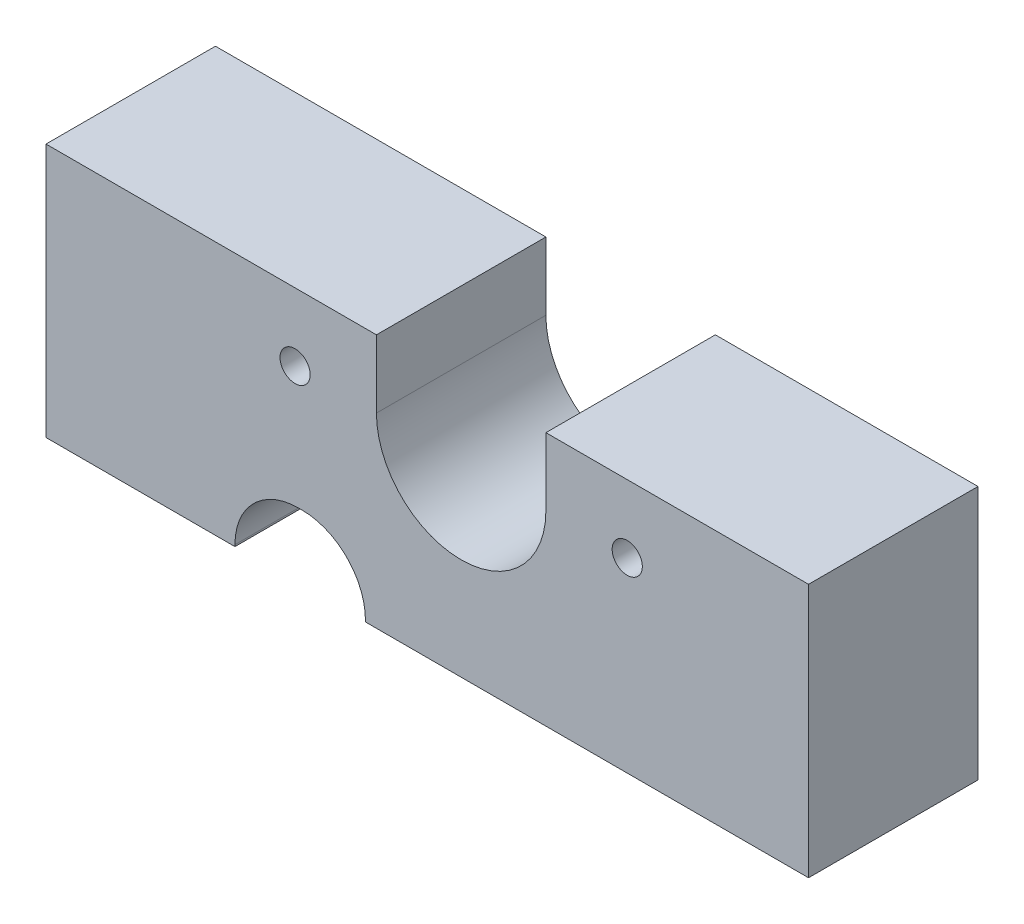
ISO-10303-21;
HEADER;
FILE_DESCRIPTION(('STEP AP214'),'2;1');
FILE_NAME('part.step','',(''),(''),'','','');
FILE_SCHEMA(('AUTOMOTIVE_DESIGN { 1 0 10303 214 1 1 1 1 }'));
ENDSEC;
DATA;
#1=APPLICATION_CONTEXT('core data for automotive mechanical design processes');
#2=APPLICATION_PROTOCOL_DEFINITION('international standard','automotive_design',2000,#1);
#3=PRODUCT_CONTEXT('',#1,'mechanical');
#4=PRODUCT('Part','Part','',(#3));
#5=PRODUCT_RELATED_PRODUCT_CATEGORY('part','',(#4));
#6=PRODUCT_DEFINITION_FORMATION('','',#4);
#7=PRODUCT_DEFINITION_CONTEXT('part definition',#1,'design');
#8=PRODUCT_DEFINITION('design','',#6,#7);
#9=PRODUCT_DEFINITION_SHAPE('','',#8);
#10=(LENGTH_UNIT() NAMED_UNIT(*) SI_UNIT(.MILLI.,.METRE.));
#11=(NAMED_UNIT(*) PLANE_ANGLE_UNIT() SI_UNIT($,.RADIAN.));
#12=(NAMED_UNIT(*) SI_UNIT($,.STERADIAN.) SOLID_ANGLE_UNIT());
#13=UNCERTAINTY_MEASURE_WITH_UNIT(LENGTH_MEASURE(1.E-05),#10,'distance_accuracy_value','');
#14=(GEOMETRIC_REPRESENTATION_CONTEXT(3) GLOBAL_UNCERTAINTY_ASSIGNED_CONTEXT((#13)) GLOBAL_UNIT_ASSIGNED_CONTEXT((#10,
#11,#12)) REPRESENTATION_CONTEXT('',''));
#15=CARTESIAN_POINT('',(0.,0.,0.));
#16=DIRECTION('',(0.,0.,1.));
#17=DIRECTION('',(1.,0.,0.));
#18=AXIS2_PLACEMENT_3D('',#15,#16,#17);
#19=CARTESIAN_POINT('',(-57.15,0.,0.));
#20=DIRECTION('',(0.,-1.,0.));
#21=DIRECTION('',(0.,0.,-1.));
#22=AXIS2_PLACEMENT_3D('',#19,#20,#21);
#23=PLANE('',#22);
#24=DIRECTION('',(0.,0.,-1.));
#25=VECTOR('',#24,1.);
#26=CARTESIAN_POINT('',(-42.9895,0.,0.));
#27=LINE('',#26,#25);
#28=CARTESIAN_POINT('',(-42.9895,0.,0.));
#29=VERTEX_POINT('',#28);
#30=CARTESIAN_POINT('',(-42.9895,0.,-12.7));
#31=VERTEX_POINT('',#30);
#32=EDGE_CURVE('E191',#29,#31,#27,.T.);
#33=ORIENTED_EDGE('',*,*,#32,.F.);
#34=DIRECTION('',(1.,0.,0.));
#35=VECTOR('',#34,1.);
#36=CARTESIAN_POINT('',(-57.15,0.,0.));
#37=LINE('',#36,#35);
#38=CARTESIAN_POINT('',(-57.15,0.,0.));
#39=VERTEX_POINT('',#38);
#40=EDGE_CURVE('E41',#39,#29,#37,.T.);
#41=ORIENTED_EDGE('',*,*,#40,.F.);
#42=DIRECTION('',(0.,0.,-1.));
#43=VECTOR('',#42,1.);
#44=CARTESIAN_POINT('',(-57.15,0.,0.));
#45=LINE('',#44,#43);
#46=CARTESIAN_POINT('',(-57.15,0.,-12.7));
#47=VERTEX_POINT('',#46);
#48=EDGE_CURVE('E261',#39,#47,#45,.T.);
#49=ORIENTED_EDGE('',*,*,#48,.T.);
#50=DIRECTION('',(1.,0.,0.));
#51=VECTOR('',#50,1.);
#52=CARTESIAN_POINT('',(-57.15,0.,-12.7));
#53=LINE('',#52,#51);
#54=EDGE_CURVE('E285',#47,#31,#53,.T.);
#55=ORIENTED_EDGE('',*,*,#54,.T.);
#56=EDGE_LOOP('',(#33,#41,#49,#55));
#57=FACE_BOUND('',#56,.T.);
#58=CARTESIAN_POINT('',(-50.8,0.,-6.35));
#59=DIRECTION('',(0.,-1.,0.));
#60=DIRECTION('',(0.,0.,-1.));
#61=AXIS2_PLACEMENT_3D('',#58,#59,#60);
#62=CIRCLE('',#61,1.7526);
#63=CARTESIAN_POINT('',(-50.8,0.,-8.1026));
#64=VERTEX_POINT('',#63);
#65=EDGE_CURVE('E245',#64,#64,#62,.T.);
#66=ORIENTED_EDGE('',*,*,#65,.F.);
#67=EDGE_LOOP('',(#66));
#68=FACE_BOUND('',#67,.T.);
#69=ADVANCED_FACE('F37',(#57,#68),#23,.T.);
#70=CARTESIAN_POINT('',(-57.15,19.05,0.));
#71=DIRECTION('',(0.,1.,0.));
#72=DIRECTION('',(0.,0.,1.));
#73=AXIS2_PLACEMENT_3D('',#70,#71,#72);
#74=PLANE('',#73);
#75=DIRECTION('',(0.,0.,-1.));
#76=VECTOR('',#75,1.);
#77=CARTESIAN_POINT('',(-32.385,19.05,0.));
#78=LINE('',#77,#76);
#79=CARTESIAN_POINT('',(-32.385,19.05,0.));
#80=VERTEX_POINT('',#79);
#81=CARTESIAN_POINT('',(-32.385,19.05,-12.7));
#82=VERTEX_POINT('',#81);
#83=EDGE_CURVE('E225',#80,#82,#78,.T.);
#84=ORIENTED_EDGE('',*,*,#83,.T.);
#85=DIRECTION('',(1.,0.,0.));
#86=VECTOR('',#85,1.);
#87=CARTESIAN_POINT('',(-57.15,19.05,-12.7));
#88=LINE('',#87,#86);
#89=CARTESIAN_POINT('',(-57.15,19.05,-12.7));
#90=VERTEX_POINT('',#89);
#91=EDGE_CURVE('E282',#90,#82,#88,.T.);
#92=ORIENTED_EDGE('',*,*,#91,.F.);
#93=DIRECTION('',(0.,0.,1.));
#94=VECTOR('',#93,1.);
#95=CARTESIAN_POINT('',(-57.15,19.05,0.));
#96=LINE('',#95,#94);
#97=CARTESIAN_POINT('',(-57.15,19.05,0.));
#98=VERTEX_POINT('',#97);
#99=EDGE_CURVE('E268',#90,#98,#96,.T.);
#100=ORIENTED_EDGE('',*,*,#99,.T.);
#101=DIRECTION('',(1.,0.,0.));
#102=VECTOR('',#101,1.);
#103=CARTESIAN_POINT('',(-57.15,19.05,0.));
#104=LINE('',#103,#102);
#105=EDGE_CURVE('E11',#98,#80,#104,.T.);
#106=ORIENTED_EDGE('',*,*,#105,.T.);
#107=EDGE_LOOP('',(#84,#92,#100,#106));
#108=FACE_BOUND('',#107,.T.);
#109=ADVANCED_FACE('F317',(#108),#74,.T.);
#110=CARTESIAN_POINT('',(-57.15,0.,0.));
#111=DIRECTION('',(0.,0.,1.));
#112=DIRECTION('',(1.,0.,0.));
#113=AXIS2_PLACEMENT_3D('',#110,#111,#112);
#114=PLANE('',#113);
#115=DIRECTION('',(0.,1.,0.));
#116=VECTOR('',#115,1.);
#117=CARTESIAN_POINT('',(-42.9895,0.,0.));
#118=LINE('',#117,#116);
#119=CARTESIAN_POINT('',(-42.9895,0.126999999999999,0.));
#120=VERTEX_POINT('',#119);
#121=EDGE_CURVE('E159',#29,#120,#118,.T.);
#122=ORIENTED_EDGE('',*,*,#121,.T.);
#123=CARTESIAN_POINT('',(-38.227,0.126999999999999,0.));
#124=DIRECTION('',(0.,0.,-1.));
#125=DIRECTION('',(1.,0.,0.));
#126=AXIS2_PLACEMENT_3D('',#123,#124,#125);
#127=CIRCLE('',#126,4.7625);
#128=CARTESIAN_POINT('',(-38.227,4.8895,0.));
#129=VERTEX_POINT('',#128);
#130=EDGE_CURVE('E151',#120,#129,#127,.T.);
#131=ORIENTED_EDGE('',*,*,#130,.T.);
#132=DIRECTION('',(1.,0.,0.));
#133=VECTOR('',#132,1.);
#134=CARTESIAN_POINT('',(-37.973,4.8895,0.));
#135=LINE('',#134,#133);
#136=CARTESIAN_POINT('',(-37.973,4.8895,0.));
#137=VERTEX_POINT('',#136);
#138=EDGE_CURVE('E162',#129,#137,#135,.T.);
#139=ORIENTED_EDGE('',*,*,#138,.T.);
#140=CARTESIAN_POINT('',(-37.973,0.126999999999999,0.));
#141=DIRECTION('',(0.,0.,-1.));
#142=DIRECTION('',(-1.,0.,0.));
#143=AXIS2_PLACEMENT_3D('',#140,#141,#142);
#144=CIRCLE('',#143,4.7625);
#145=CARTESIAN_POINT('',(-33.2105,0.126999999999999,0.));
#146=VERTEX_POINT('',#145);
#147=EDGE_CURVE('E167',#137,#146,#144,.T.);
#148=ORIENTED_EDGE('',*,*,#147,.T.);
#149=DIRECTION('',(0.,-1.,0.));
#150=VECTOR('',#149,1.);
#151=CARTESIAN_POINT('',(-33.2105,0.,0.));
#152=LINE('',#151,#150);
#153=CARTESIAN_POINT('',(-33.2105,0.,0.));
#154=VERTEX_POINT('',#153);
#155=EDGE_CURVE('E177',#146,#154,#152,.T.);
#156=ORIENTED_EDGE('',*,*,#155,.T.);
#157=CARTESIAN_POINT('',(0.,0.,0.));
#158=VERTEX_POINT('',#157);
#159=EDGE_CURVE('E271',#154,#158,#37,.T.);
#160=ORIENTED_EDGE('',*,*,#159,.T.);
#161=DIRECTION('',(0.,-1.,0.));
#162=VECTOR('',#161,1.);
#163=CARTESIAN_POINT('',(0.,0.,0.));
#164=LINE('',#163,#162);
#165=CARTESIAN_POINT('',(0.,19.05,0.));
#166=VERTEX_POINT('',#165);
#167=EDGE_CURVE('E257',#166,#158,#164,.T.);
#168=ORIENTED_EDGE('',*,*,#167,.F.);
#169=CARTESIAN_POINT('',(-19.685,19.05,0.));
#170=VERTEX_POINT('',#169);
#171=EDGE_CURVE('E46',#170,#166,#104,.T.);
#172=ORIENTED_EDGE('',*,*,#171,.F.);
#173=DIRECTION('',(0.,-1.,0.));
#174=VECTOR('',#173,1.);
#175=CARTESIAN_POINT('',(-19.685,19.05,0.));
#176=LINE('',#175,#174);
#177=CARTESIAN_POINT('',(-19.685,13.97,0.));
#178=VERTEX_POINT('',#177);
#179=EDGE_CURVE('E210',#170,#178,#176,.T.);
#180=ORIENTED_EDGE('',*,*,#179,.T.);
#181=CARTESIAN_POINT('',(-26.035,13.97,0.));
#182=DIRECTION('',(0.,0.,-1.));
#183=DIRECTION('',(-1.,0.,0.));
#184=AXIS2_PLACEMENT_3D('',#181,#182,#183);
#185=CIRCLE('',#184,6.34999999999999);
#186=CARTESIAN_POINT('',(-32.385,13.97,0.));
#187=VERTEX_POINT('',#186);
#188=EDGE_CURVE('E213',#178,#187,#185,.T.);
#189=ORIENTED_EDGE('',*,*,#188,.T.);
#190=DIRECTION('',(0.,1.,0.));
#191=VECTOR('',#190,1.);
#192=CARTESIAN_POINT('',(-32.385,19.05,0.));
#193=LINE('',#192,#191);
#194=EDGE_CURVE('E217',#187,#80,#193,.T.);
#195=ORIENTED_EDGE('',*,*,#194,.T.);
#196=ORIENTED_EDGE('',*,*,#105,.F.);
#197=DIRECTION('',(0.,-1.,0.));
#198=VECTOR('',#197,1.);
#199=CARTESIAN_POINT('',(-57.15,0.,0.));
#200=LINE('',#199,#198);
#201=EDGE_CURVE('E258',#98,#39,#200,.T.);
#202=ORIENTED_EDGE('',*,*,#201,.T.);
#203=ORIENTED_EDGE('',*,*,#40,.T.);
#204=EDGE_LOOP('',(#122,#131,#139,#148,#156,#160,#168,#172,#180,#189,#195,#196,#202,#203));
#205=FACE_BOUND('',#204,.T.);
#206=CARTESIAN_POINT('',(-13.589,13.97,0.));
#207=DIRECTION('',(0.,0.,-1.));
#208=DIRECTION('',(-1.,0.,0.));
#209=AXIS2_PLACEMENT_3D('',#206,#207,#208);
#210=CIRCLE('',#209,1.1303);
#211=CARTESIAN_POINT('',(-14.7193,13.97,0.));
#212=VERTEX_POINT('',#211);
#213=EDGE_CURVE('E200',#212,#212,#210,.T.);
#214=ORIENTED_EDGE('',*,*,#213,.T.);
#215=EDGE_LOOP('',(#214));
#216=FACE_BOUND('',#215,.T.);
#217=CARTESIAN_POINT('',(-38.481,13.97,0.));
#218=DIRECTION('',(0.,0.,-1.));
#219=DIRECTION('',(-1.,0.,0.));
#220=AXIS2_PLACEMENT_3D('',#217,#218,#219);
#221=CIRCLE('',#220,1.13029999999999);
#222=CARTESIAN_POINT('',(-39.6113,13.97,0.));
#223=VERTEX_POINT('',#222);
#224=EDGE_CURVE('E206',#223,#223,#221,.T.);
#225=ORIENTED_EDGE('',*,*,#224,.T.);
#226=EDGE_LOOP('',(#225));
#227=FACE_BOUND('',#226,.T.);
#228=ADVANCED_FACE('F39',(#205,#216,#227),#114,.T.);
#229=DIRECTION('',(0.,0.,-1.));
#230=VECTOR('',#229,1.);
#231=CARTESIAN_POINT('',(-19.685,19.05,0.));
#232=LINE('',#231,#230);
#233=CARTESIAN_POINT('',(-19.685,19.05,-12.7));
#234=VERTEX_POINT('',#233);
#235=EDGE_CURVE('E62',#170,#234,#232,.T.);
#236=ORIENTED_EDGE('',*,*,#235,.F.);
#237=ORIENTED_EDGE('',*,*,#171,.T.);
#238=DIRECTION('',(0.,0.,1.));
#239=VECTOR('',#238,1.);
#240=CARTESIAN_POINT('',(0.,19.05,0.));
#241=LINE('',#240,#239);
#242=CARTESIAN_POINT('',(0.,19.05,-12.7));
#243=VERTEX_POINT('',#242);
#244=EDGE_CURVE('E262',#243,#166,#241,.T.);
#245=ORIENTED_EDGE('',*,*,#244,.F.);
#246=EDGE_CURVE('E284',#234,#243,#88,.T.);
#247=ORIENTED_EDGE('',*,*,#246,.F.);
#248=EDGE_LOOP('',(#236,#237,#245,#247));
#249=FACE_BOUND('',#248,.T.);
#250=ADVANCED_FACE('F305',(#249),#74,.T.);
#251=CARTESIAN_POINT('',(-57.15,0.,-12.7));
#252=DIRECTION('',(0.,0.,-1.));
#253=DIRECTION('',(-1.,0.,0.));
#254=AXIS2_PLACEMENT_3D('',#251,#252,#253);
#255=PLANE('',#254);
#256=DIRECTION('',(0.,1.,0.));
#257=VECTOR('',#256,1.);
#258=CARTESIAN_POINT('',(-42.9895,0.,-12.7));
#259=LINE('',#258,#257);
#260=CARTESIAN_POINT('',(-42.9895,0.126999999999999,-12.7));
#261=VERTEX_POINT('',#260);
#262=EDGE_CURVE('E171',#31,#261,#259,.T.);
#263=ORIENTED_EDGE('',*,*,#262,.F.);
#264=ORIENTED_EDGE('',*,*,#54,.F.);
#265=DIRECTION('',(0.,1.,0.));
#266=VECTOR('',#265,1.);
#267=CARTESIAN_POINT('',(-57.15,0.,-12.7));
#268=LINE('',#267,#266);
#269=EDGE_CURVE('E265',#47,#90,#268,.T.);
#270=ORIENTED_EDGE('',*,*,#269,.T.);
#271=ORIENTED_EDGE('',*,*,#91,.T.);
#272=DIRECTION('',(0.,1.,0.));
#273=VECTOR('',#272,1.);
#274=CARTESIAN_POINT('',(-32.385,19.05,-12.7));
#275=LINE('',#274,#273);
#276=CARTESIAN_POINT('',(-32.385,13.97,-12.7));
#277=VERTEX_POINT('',#276);
#278=EDGE_CURVE('E214',#277,#82,#275,.T.);
#279=ORIENTED_EDGE('',*,*,#278,.F.);
#280=CARTESIAN_POINT('',(-26.035,13.97,-12.7));
#281=DIRECTION('',(0.,0.,-1.));
#282=DIRECTION('',(-1.,0.,0.));
#283=AXIS2_PLACEMENT_3D('',#280,#281,#282);
#284=CIRCLE('',#283,6.34999999999999);
#285=CARTESIAN_POINT('',(-19.685,13.97,-12.7));
#286=VERTEX_POINT('',#285);
#287=EDGE_CURVE('E221',#286,#277,#284,.T.);
#288=ORIENTED_EDGE('',*,*,#287,.F.);
#289=DIRECTION('',(0.,-1.,0.));
#290=VECTOR('',#289,1.);
#291=CARTESIAN_POINT('',(-19.685,19.05,-12.7));
#292=LINE('',#291,#290);
#293=EDGE_CURVE('E209',#234,#286,#292,.T.);
#294=ORIENTED_EDGE('',*,*,#293,.F.);
#295=ORIENTED_EDGE('',*,*,#246,.T.);
#296=DIRECTION('',(0.,1.,0.));
#297=VECTOR('',#296,1.);
#298=CARTESIAN_POINT('',(0.,0.,-12.7));
#299=LINE('',#298,#297);
#300=CARTESIAN_POINT('',(0.,0.,-12.7));
#301=VERTEX_POINT('',#300);
#302=EDGE_CURVE('E277',#301,#243,#299,.T.);
#303=ORIENTED_EDGE('',*,*,#302,.F.);
#304=CARTESIAN_POINT('',(-33.2105,0.,-12.7));
#305=VERTEX_POINT('',#304);
#306=EDGE_CURVE('E287',#305,#301,#53,.T.);
#307=ORIENTED_EDGE('',*,*,#306,.F.);
#308=DIRECTION('',(0.,-1.,0.));
#309=VECTOR('',#308,1.);
#310=CARTESIAN_POINT('',(-33.2105,0.,-12.7));
#311=LINE('',#310,#309);
#312=CARTESIAN_POINT('',(-33.2105,0.126999999999999,-12.7));
#313=VERTEX_POINT('',#312);
#314=EDGE_CURVE('E54',#313,#305,#311,.T.);
#315=ORIENTED_EDGE('',*,*,#314,.F.);
#316=CARTESIAN_POINT('',(-37.973,0.126999999999999,-12.7));
#317=DIRECTION('',(0.,0.,-1.));
#318=DIRECTION('',(-1.,0.,0.));
#319=AXIS2_PLACEMENT_3D('',#316,#317,#318);
#320=CIRCLE('',#319,4.7625);
#321=CARTESIAN_POINT('',(-37.973,4.8895,-12.7));
#322=VERTEX_POINT('',#321);
#323=EDGE_CURVE('E184',#322,#313,#320,.T.);
#324=ORIENTED_EDGE('',*,*,#323,.F.);
#325=DIRECTION('',(1.,0.,0.));
#326=VECTOR('',#325,1.);
#327=CARTESIAN_POINT('',(-37.973,4.8895,-12.7));
#328=LINE('',#327,#326);
#329=CARTESIAN_POINT('',(-38.227,4.8895,-12.7));
#330=VERTEX_POINT('',#329);
#331=EDGE_CURVE('E182',#330,#322,#328,.T.);
#332=ORIENTED_EDGE('',*,*,#331,.F.);
#333=CARTESIAN_POINT('',(-38.227,0.126999999999999,-12.7));
#334=DIRECTION('',(0.,0.,-1.));
#335=DIRECTION('',(1.,0.,0.));
#336=AXIS2_PLACEMENT_3D('',#333,#334,#335);
#337=CIRCLE('',#336,4.7625);
#338=EDGE_CURVE('E154',#261,#330,#337,.T.);
#339=ORIENTED_EDGE('',*,*,#338,.F.);
#340=EDGE_LOOP('',(#263,#264,#270,#271,#279,#288,#294,#295,#303,#307,#315,#324,#332,#339));
#341=FACE_BOUND('',#340,.T.);
#342=CARTESIAN_POINT('',(-13.589,13.97,-12.7));
#343=DIRECTION('',(0.,0.,-1.));
#344=DIRECTION('',(-1.,0.,0.));
#345=AXIS2_PLACEMENT_3D('',#342,#343,#344);
#346=CIRCLE('',#345,1.1303);
#347=CARTESIAN_POINT('',(-14.7193,13.97,-12.7));
#348=VERTEX_POINT('',#347);
#349=EDGE_CURVE('E190',#348,#348,#346,.T.);
#350=ORIENTED_EDGE('',*,*,#349,.F.);
#351=EDGE_LOOP('',(#350));
#352=FACE_BOUND('',#351,.T.);
#353=CARTESIAN_POINT('',(-38.481,13.97,-12.7));
#354=DIRECTION('',(0.,0.,-1.));
#355=DIRECTION('',(-1.,0.,0.));
#356=AXIS2_PLACEMENT_3D('',#353,#354,#355);
#357=CIRCLE('',#356,1.1303);
#358=CARTESIAN_POINT('',(-39.6113,13.97,-12.7));
#359=VERTEX_POINT('',#358);
#360=EDGE_CURVE('E203',#359,#359,#357,.T.);
#361=ORIENTED_EDGE('',*,*,#360,.F.);
#362=EDGE_LOOP('',(#361));
#363=FACE_BOUND('',#362,.T.);
#364=ADVANCED_FACE('F328',(#341,#352,#363),#255,.T.);
#365=DIRECTION('',(0.,0.,-1.));
#366=VECTOR('',#365,1.);
#367=CARTESIAN_POINT('',(-33.2105,0.,0.));
#368=LINE('',#367,#366);
#369=EDGE_CURVE('E193',#154,#305,#368,.T.);
#370=ORIENTED_EDGE('',*,*,#369,.T.);
#371=ORIENTED_EDGE('',*,*,#306,.T.);
#372=DIRECTION('',(0.,0.,-1.));
#373=VECTOR('',#372,1.);
#374=CARTESIAN_POINT('',(0.,0.,0.));
#375=LINE('',#374,#373);
#376=EDGE_CURVE('E274',#158,#301,#375,.T.);
#377=ORIENTED_EDGE('',*,*,#376,.F.);
#378=ORIENTED_EDGE('',*,*,#159,.F.);
#379=EDGE_LOOP('',(#370,#371,#377,#378));
#380=FACE_BOUND('',#379,.T.);
#381=CARTESIAN_POINT('',(-6.35,0.,-6.35000000000001));
#382=DIRECTION('',(0.,-1.,0.));
#383=DIRECTION('',(0.,0.,-1.));
#384=AXIS2_PLACEMENT_3D('',#381,#382,#383);
#385=CIRCLE('',#384,1.7526);
#386=CARTESIAN_POINT('',(-6.35,0.,-8.10260000000001));
#387=VERTEX_POINT('',#386);
#388=EDGE_CURVE('E228',#387,#387,#385,.T.);
#389=ORIENTED_EDGE('',*,*,#388,.F.);
#390=EDGE_LOOP('',(#389));
#391=FACE_BOUND('',#390,.T.);
#392=ADVANCED_FACE('F298',(#380,#391),#23,.T.);
#393=CARTESIAN_POINT('',(-57.15,0.,0.));
#394=DIRECTION('',(-1.,0.,0.));
#395=DIRECTION('',(0.,0.,1.));
#396=AXIS2_PLACEMENT_3D('',#393,#394,#395);
#397=PLANE('',#396);
#398=ORIENTED_EDGE('',*,*,#201,.F.);
#399=ORIENTED_EDGE('',*,*,#99,.F.);
#400=ORIENTED_EDGE('',*,*,#269,.F.);
#401=ORIENTED_EDGE('',*,*,#48,.F.);
#402=EDGE_LOOP('',(#398,#399,#400,#401));
#403=FACE_BOUND('',#402,.T.);
#404=ADVANCED_FACE('F321',(#403),#397,.T.);
#405=CARTESIAN_POINT('',(0.,0.,0.));
#406=DIRECTION('',(-1.,0.,0.));
#407=DIRECTION('',(0.,0.,1.));
#408=AXIS2_PLACEMENT_3D('',#405,#406,#407);
#409=PLANE('',#408);
#410=ORIENTED_EDGE('',*,*,#167,.T.);
#411=ORIENTED_EDGE('',*,*,#376,.T.);
#412=ORIENTED_EDGE('',*,*,#302,.T.);
#413=ORIENTED_EDGE('',*,*,#244,.T.);
#414=EDGE_LOOP('',(#410,#411,#412,#413));
#415=FACE_BOUND('',#414,.T.);
#416=ADVANCED_FACE('F301',(#415),#409,.F.);
#417=CARTESIAN_POINT('',(-50.8,12.7,-6.35));
#418=DIRECTION('',(0.,-1.,0.));
#419=DIRECTION('',(0.,0.,-1.));
#420=AXIS2_PLACEMENT_3D('',#417,#418,#419);
#421=CONICAL_SURFACE('',#420,1.35254999999999,1.02974425867665);
#422=CARTESIAN_POINT('',(-50.8,13.5126940302657,-6.35));
#423=VERTEX_POINT('',#422);
#424=VERTEX_LOOP('',#423);
#425=FACE_BOUND('',#424,.T.);
#426=CARTESIAN_POINT('',(-50.8,12.7,-6.35));
#427=DIRECTION('',(0.,-1.,0.));
#428=DIRECTION('',(0.,0.,-1.));
#429=AXIS2_PLACEMENT_3D('',#426,#427,#428);
#430=CIRCLE('',#429,1.35254999999999);
#431=CARTESIAN_POINT('',(-50.8,12.7,-7.70255));
#432=VERTEX_POINT('',#431);
#433=EDGE_CURVE('E254',#432,#432,#430,.T.);
#434=ORIENTED_EDGE('',*,*,#433,.T.);
#435=EDGE_LOOP('',(#434));
#436=FACE_BOUND('',#435,.T.);
#437=ADVANCED_FACE('F359',(#425,#436),#421,.F.);
#438=CARTESIAN_POINT('',(-50.8,0.,-6.35));
#439=DIRECTION('',(0.,-1.,0.));
#440=DIRECTION('',(0.,0.,-1.));
#441=AXIS2_PLACEMENT_3D('',#438,#439,#440);
#442=CYLINDRICAL_SURFACE('',#441,1.35254999999999);
#443=ORIENTED_EDGE('',*,*,#433,.F.);
#444=EDGE_LOOP('',(#443));
#445=FACE_BOUND('',#444,.T.);
#446=CARTESIAN_POINT('',(-50.8,10.795,-6.35));
#447=DIRECTION('',(0.,-1.,0.));
#448=DIRECTION('',(0.,0.,-1.));
#449=AXIS2_PLACEMENT_3D('',#446,#447,#448);
#450=CIRCLE('',#449,1.35254999999999);
#451=CARTESIAN_POINT('',(-50.8,10.795,-7.70255));
#452=VERTEX_POINT('',#451);
#453=EDGE_CURVE('E251',#452,#452,#450,.T.);
#454=ORIENTED_EDGE('',*,*,#453,.T.);
#455=EDGE_LOOP('',(#454));
#456=FACE_BOUND('',#455,.T.);
#457=ADVANCED_FACE('F363',(#445,#456),#442,.F.);
#458=CARTESIAN_POINT('',(-49.44745,10.795,-6.35));
#459=DIRECTION('',(0.,1.,0.));
#460=DIRECTION('',(0.,0.,1.));
#461=AXIS2_PLACEMENT_3D('',#458,#459,#460);
#462=PLANE('',#461);
#463=ORIENTED_EDGE('',*,*,#453,.F.);
#464=EDGE_LOOP('',(#463));
#465=FACE_BOUND('',#464,.T.);
#466=CARTESIAN_POINT('',(-50.8,10.795,-6.35));
#467=DIRECTION('',(0.,-1.,0.));
#468=DIRECTION('',(0.,0.,-1.));
#469=AXIS2_PLACEMENT_3D('',#466,#467,#468);
#470=CIRCLE('',#469,1.7526);
#471=CARTESIAN_POINT('',(-50.8,10.795,-8.1026));
#472=VERTEX_POINT('',#471);
#473=EDGE_CURVE('E248',#472,#472,#470,.T.);
#474=ORIENTED_EDGE('',*,*,#473,.T.);
#475=EDGE_LOOP('',(#474));
#476=FACE_BOUND('',#475,.T.);
#477=ADVANCED_FACE('F367',(#465,#476),#462,.F.);
#478=CARTESIAN_POINT('',(-50.8,0.,-6.35));
#479=DIRECTION('',(0.,-1.,0.));
#480=DIRECTION('',(0.,0.,-1.));
#481=AXIS2_PLACEMENT_3D('',#478,#479,#480);
#482=CYLINDRICAL_SURFACE('',#481,1.7526);
#483=ORIENTED_EDGE('',*,*,#473,.F.);
#484=EDGE_LOOP('',(#483));
#485=FACE_BOUND('',#484,.T.);
#486=ORIENTED_EDGE('',*,*,#65,.T.);
#487=EDGE_LOOP('',(#486));
#488=FACE_BOUND('',#487,.T.);
#489=ADVANCED_FACE('F371',(#485,#488),#482,.F.);
#490=CARTESIAN_POINT('',(-6.35,12.7,-6.35000000000001));
#491=DIRECTION('',(0.,-1.,0.));
#492=DIRECTION('',(0.,0.,-1.));
#493=AXIS2_PLACEMENT_3D('',#490,#491,#492);
#494=CONICAL_SURFACE('',#493,1.35255,1.02974425867665);
#495=CARTESIAN_POINT('',(-6.35,13.5126940302657,-6.35000000000001));
#496=VERTEX_POINT('',#495);
#497=VERTEX_LOOP('',#496);
#498=FACE_BOUND('',#497,.T.);
#499=CARTESIAN_POINT('',(-6.35,12.7,-6.35000000000001));
#500=DIRECTION('',(0.,-1.,0.));
#501=DIRECTION('',(0.,0.,-1.));
#502=AXIS2_PLACEMENT_3D('',#499,#500,#501);
#503=CIRCLE('',#502,1.35255);
#504=CARTESIAN_POINT('',(-6.35,12.7,-7.70255));
#505=VERTEX_POINT('',#504);
#506=EDGE_CURVE('E242',#505,#505,#503,.T.);
#507=ORIENTED_EDGE('',*,*,#506,.T.);
#508=EDGE_LOOP('',(#507));
#509=FACE_BOUND('',#508,.T.);
#510=ADVANCED_FACE('F375',(#498,#509),#494,.F.);
#511=CARTESIAN_POINT('',(-6.35,0.,-6.35000000000001));
#512=DIRECTION('',(0.,-1.,0.));
#513=DIRECTION('',(0.,0.,-1.));
#514=AXIS2_PLACEMENT_3D('',#511,#512,#513);
#515=CYLINDRICAL_SURFACE('',#514,1.35255);
#516=ORIENTED_EDGE('',*,*,#506,.F.);
#517=EDGE_LOOP('',(#516));
#518=FACE_BOUND('',#517,.T.);
#519=CARTESIAN_POINT('',(-6.35,10.795,-6.35000000000001));
#520=DIRECTION('',(0.,-1.,0.));
#521=DIRECTION('',(0.,0.,-1.));
#522=AXIS2_PLACEMENT_3D('',#519,#520,#521);
#523=CIRCLE('',#522,1.35255);
#524=CARTESIAN_POINT('',(-6.35,10.795,-7.70255));
#525=VERTEX_POINT('',#524);
#526=EDGE_CURVE('E239',#525,#525,#523,.T.);
#527=ORIENTED_EDGE('',*,*,#526,.T.);
#528=EDGE_LOOP('',(#527));
#529=FACE_BOUND('',#528,.T.);
#530=ADVANCED_FACE('F379',(#518,#529),#515,.F.);
#531=CARTESIAN_POINT('',(-4.99745,10.795,-6.35000000000001));
#532=DIRECTION('',(0.,1.,0.));
#533=DIRECTION('',(0.,0.,1.));
#534=AXIS2_PLACEMENT_3D('',#531,#532,#533);
#535=PLANE('',#534);
#536=ORIENTED_EDGE('',*,*,#526,.F.);
#537=EDGE_LOOP('',(#536));
#538=FACE_BOUND('',#537,.T.);
#539=CARTESIAN_POINT('',(-6.35,10.795,-6.35000000000001));
#540=DIRECTION('',(0.,-1.,0.));
#541=DIRECTION('',(0.,0.,-1.));
#542=AXIS2_PLACEMENT_3D('',#539,#540,#541);
#543=CIRCLE('',#542,1.7526);
#544=CARTESIAN_POINT('',(-6.35,10.795,-8.1026));
#545=VERTEX_POINT('',#544);
#546=EDGE_CURVE('E236',#545,#545,#543,.T.);
#547=ORIENTED_EDGE('',*,*,#546,.T.);
#548=EDGE_LOOP('',(#547));
#549=FACE_BOUND('',#548,.T.);
#550=ADVANCED_FACE('F383',(#538,#549),#535,.F.);
#551=CARTESIAN_POINT('',(-6.35,0.,-6.35000000000001));
#552=DIRECTION('',(0.,-1.,0.));
#553=DIRECTION('',(0.,0.,-1.));
#554=AXIS2_PLACEMENT_3D('',#551,#552,#553);
#555=CYLINDRICAL_SURFACE('',#554,1.7526);
#556=ORIENTED_EDGE('',*,*,#546,.F.);
#557=EDGE_LOOP('',(#556));
#558=FACE_BOUND('',#557,.T.);
#559=ORIENTED_EDGE('',*,*,#388,.T.);
#560=EDGE_LOOP('',(#559));
#561=FACE_BOUND('',#560,.T.);
#562=ADVANCED_FACE('F387',(#558,#561),#555,.F.);
#563=CARTESIAN_POINT('',(-32.385,19.05,0.));
#564=DIRECTION('',(-1.,0.,0.));
#565=DIRECTION('',(0.,-1.,0.));
#566=AXIS2_PLACEMENT_3D('',#563,#564,#565);
#567=PLANE('',#566);
#568=ORIENTED_EDGE('',*,*,#278,.T.);
#569=ORIENTED_EDGE('',*,*,#83,.F.);
#570=ORIENTED_EDGE('',*,*,#194,.F.);
#571=DIRECTION('',(0.,0.,-1.));
#572=VECTOR('',#571,1.);
#573=CARTESIAN_POINT('',(-32.385,13.97,0.));
#574=LINE('',#573,#572);
#575=EDGE_CURVE('E229',#187,#277,#574,.T.);
#576=ORIENTED_EDGE('',*,*,#575,.T.);
#577=EDGE_LOOP('',(#568,#569,#570,#576));
#578=FACE_BOUND('',#577,.T.);
#579=ADVANCED_FACE('F314',(#578),#567,.F.);
#580=CARTESIAN_POINT('',(-26.035,13.97,0.));
#581=DIRECTION('',(0.,0.,-1.));
#582=DIRECTION('',(-1.,0.,0.));
#583=AXIS2_PLACEMENT_3D('',#580,#581,#582);
#584=CYLINDRICAL_SURFACE('',#583,6.34999999999999);
#585=ORIENTED_EDGE('',*,*,#287,.T.);
#586=ORIENTED_EDGE('',*,*,#575,.F.);
#587=ORIENTED_EDGE('',*,*,#188,.F.);
#588=DIRECTION('',(0.,0.,-1.));
#589=VECTOR('',#588,1.);
#590=CARTESIAN_POINT('',(-19.685,13.97,0.));
#591=LINE('',#590,#589);
#592=EDGE_CURVE('E231',#178,#286,#591,.T.);
#593=ORIENTED_EDGE('',*,*,#592,.T.);
#594=EDGE_LOOP('',(#585,#586,#587,#593));
#595=FACE_BOUND('',#594,.T.);
#596=ADVANCED_FACE('F310',(#595),#584,.F.);
#597=CARTESIAN_POINT('',(-19.685,19.05,0.));
#598=DIRECTION('',(1.,0.,0.));
#599=DIRECTION('',(0.,1.,0.));
#600=AXIS2_PLACEMENT_3D('',#597,#598,#599);
#601=PLANE('',#600);
#602=ORIENTED_EDGE('',*,*,#293,.T.);
#603=ORIENTED_EDGE('',*,*,#592,.F.);
#604=ORIENTED_EDGE('',*,*,#179,.F.);
#605=ORIENTED_EDGE('',*,*,#235,.T.);
#606=EDGE_LOOP('',(#602,#603,#604,#605));
#607=FACE_BOUND('',#606,.T.);
#608=ADVANCED_FACE('F307',(#607),#601,.F.);
#609=CARTESIAN_POINT('',(-38.481,13.97,-12.7));
#610=DIRECTION('',(0.,0.,-1.));
#611=DIRECTION('',(-1.,0.,0.));
#612=AXIS2_PLACEMENT_3D('',#609,#610,#611);
#613=CYLINDRICAL_SURFACE('',#612,1.1303);
#614=ORIENTED_EDGE('',*,*,#224,.F.);
#615=EDGE_LOOP('',(#614));
#616=FACE_BOUND('',#615,.T.);
#617=ORIENTED_EDGE('',*,*,#360,.T.);
#618=EDGE_LOOP('',(#617));
#619=FACE_BOUND('',#618,.T.);
#620=ADVANCED_FACE('F394',(#616,#619),#613,.F.);
#621=CARTESIAN_POINT('',(-13.589,13.97,-12.7));
#622=DIRECTION('',(0.,0.,-1.));
#623=DIRECTION('',(-1.,0.,0.));
#624=AXIS2_PLACEMENT_3D('',#621,#622,#623);
#625=CYLINDRICAL_SURFACE('',#624,1.1303);
#626=ORIENTED_EDGE('',*,*,#213,.F.);
#627=EDGE_LOOP('',(#626));
#628=FACE_BOUND('',#627,.T.);
#629=ORIENTED_EDGE('',*,*,#349,.T.);
#630=EDGE_LOOP('',(#629));
#631=FACE_BOUND('',#630,.T.);
#632=ADVANCED_FACE('F401',(#628,#631),#625,.F.);
#633=CARTESIAN_POINT('',(-38.227,0.126999999999999,0.));
#634=DIRECTION('',(0.,0.,-1.));
#635=DIRECTION('',(-1.,0.,0.));
#636=AXIS2_PLACEMENT_3D('',#633,#634,#635);
#637=CYLINDRICAL_SURFACE('',#636,4.7625);
#638=ORIENTED_EDGE('',*,*,#338,.T.);
#639=DIRECTION('',(0.,0.,-1.));
#640=VECTOR('',#639,1.);
#641=CARTESIAN_POINT('',(-38.227,4.8895,0.));
#642=LINE('',#641,#640);
#643=EDGE_CURVE('E147',#129,#330,#642,.T.);
#644=ORIENTED_EDGE('',*,*,#643,.F.);
#645=ORIENTED_EDGE('',*,*,#130,.F.);
#646=DIRECTION('',(0.,0.,-1.));
#647=VECTOR('',#646,1.);
#648=CARTESIAN_POINT('',(-42.9895,0.126999999999999,0.));
#649=LINE('',#648,#647);
#650=EDGE_CURVE('E188',#120,#261,#649,.T.);
#651=ORIENTED_EDGE('',*,*,#650,.T.);
#652=EDGE_LOOP('',(#638,#644,#645,#651));
#653=FACE_BOUND('',#652,.T.);
#654=ADVANCED_FACE('F149',(#653),#637,.F.);
#655=CARTESIAN_POINT('',(-42.9895,0.,0.));
#656=DIRECTION('',(-1.,0.,0.));
#657=DIRECTION('',(0.,0.,1.));
#658=AXIS2_PLACEMENT_3D('',#655,#656,#657);
#659=PLANE('',#658);
#660=ORIENTED_EDGE('',*,*,#262,.T.);
#661=ORIENTED_EDGE('',*,*,#650,.F.);
#662=ORIENTED_EDGE('',*,*,#121,.F.);
#663=ORIENTED_EDGE('',*,*,#32,.T.);
#664=EDGE_LOOP('',(#660,#661,#662,#663));
#665=FACE_BOUND('',#664,.T.);
#666=ADVANCED_FACE('F326',(#665),#659,.F.);
#667=CARTESIAN_POINT('',(-33.2105,0.,0.));
#668=DIRECTION('',(1.,0.,0.));
#669=DIRECTION('',(0.,0.,-1.));
#670=AXIS2_PLACEMENT_3D('',#667,#668,#669);
#671=PLANE('',#670);
#672=ORIENTED_EDGE('',*,*,#314,.T.);
#673=ORIENTED_EDGE('',*,*,#369,.F.);
#674=ORIENTED_EDGE('',*,*,#155,.F.);
#675=DIRECTION('',(0.,0.,-1.));
#676=VECTOR('',#675,1.);
#677=CARTESIAN_POINT('',(-33.2105,0.126999999999999,0.));
#678=LINE('',#677,#676);
#679=EDGE_CURVE('E195',#146,#313,#678,.T.);
#680=ORIENTED_EDGE('',*,*,#679,.T.);
#681=EDGE_LOOP('',(#672,#673,#674,#680));
#682=FACE_BOUND('',#681,.T.);
#683=ADVANCED_FACE('F333',(#682),#671,.F.);
#684=CARTESIAN_POINT('',(-37.973,0.126999999999999,0.));
#685=DIRECTION('',(0.,0.,-1.));
#686=DIRECTION('',(-1.,0.,0.));
#687=AXIS2_PLACEMENT_3D('',#684,#685,#686);
#688=CYLINDRICAL_SURFACE('',#687,4.7625);
#689=ORIENTED_EDGE('',*,*,#323,.T.);
#690=ORIENTED_EDGE('',*,*,#679,.F.);
#691=ORIENTED_EDGE('',*,*,#147,.F.);
#692=DIRECTION('',(0.,0.,-1.));
#693=VECTOR('',#692,1.);
#694=CARTESIAN_POINT('',(-37.973,4.8895,0.));
#695=LINE('',#694,#693);
#696=EDGE_CURVE('E158',#137,#322,#695,.T.);
#697=ORIENTED_EDGE('',*,*,#696,.T.);
#698=EDGE_LOOP('',(#689,#690,#691,#697));
#699=FACE_BOUND('',#698,.T.);
#700=ADVANCED_FACE('F332',(#699),#688,.F.);
#701=CARTESIAN_POINT('',(-37.973,4.8895,0.));
#702=DIRECTION('',(0.,1.,0.));
#703=DIRECTION('',(0.,0.,1.));
#704=AXIS2_PLACEMENT_3D('',#701,#702,#703);
#705=PLANE('',#704);
#706=ORIENTED_EDGE('',*,*,#331,.T.);
#707=ORIENTED_EDGE('',*,*,#696,.F.);
#708=ORIENTED_EDGE('',*,*,#138,.F.);
#709=ORIENTED_EDGE('',*,*,#643,.T.);
#710=EDGE_LOOP('',(#706,#707,#708,#709));
#711=FACE_BOUND('',#710,.T.);
#712=ADVANCED_FACE('F163',(#711),#705,.F.);
#713=CLOSED_SHELL('',(#69,#109,#228,#250,#364,#392,#404,#416,#437,#457,#477,#489,#510,#530,#550,
#562,#579,#596,#608,#620,#632,#654,#666,#683,#700,#712));
#714=MANIFOLD_SOLID_BREP('B2',#713);
#715=ADVANCED_BREP_SHAPE_REPRESENTATION('',(#18,#714),#14);
#716=SHAPE_DEFINITION_REPRESENTATION(#9,#715);
ENDSEC;
END-ISO-10303-21;
